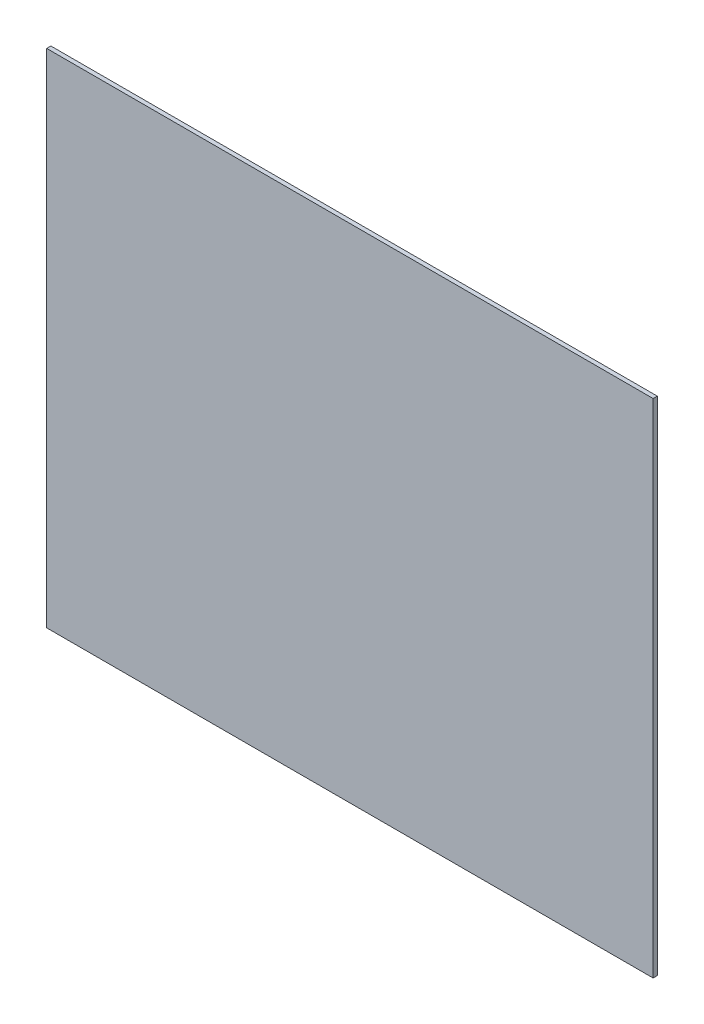
ISO-10303-21;
HEADER;
FILE_DESCRIPTION(('STEP AP214'),'2;1');
FILE_NAME('part.step','',(''),(''),'','','');
FILE_SCHEMA(('AUTOMOTIVE_DESIGN { 1 0 10303 214 1 1 1 1 }'));
ENDSEC;
DATA;
#1=APPLICATION_CONTEXT('core data for automotive mechanical design processes');
#2=APPLICATION_PROTOCOL_DEFINITION('international standard','automotive_design',2000,#1);
#3=PRODUCT_CONTEXT('',#1,'mechanical');
#4=PRODUCT('Part','Part','',(#3));
#5=PRODUCT_RELATED_PRODUCT_CATEGORY('part','',(#4));
#6=PRODUCT_DEFINITION_FORMATION('','',#4);
#7=PRODUCT_DEFINITION_CONTEXT('part definition',#1,'design');
#8=PRODUCT_DEFINITION('design','',#6,#7);
#9=PRODUCT_DEFINITION_SHAPE('','',#8);
#10=(LENGTH_UNIT() NAMED_UNIT(*) SI_UNIT(.MILLI.,.METRE.));
#11=(NAMED_UNIT(*) PLANE_ANGLE_UNIT() SI_UNIT($,.RADIAN.));
#12=(NAMED_UNIT(*) SI_UNIT($,.STERADIAN.) SOLID_ANGLE_UNIT());
#13=UNCERTAINTY_MEASURE_WITH_UNIT(LENGTH_MEASURE(1.E-05),#10,'distance_accuracy_value','');
#14=(GEOMETRIC_REPRESENTATION_CONTEXT(3) GLOBAL_UNCERTAINTY_ASSIGNED_CONTEXT((#13)) GLOBAL_UNIT_ASSIGNED_CONTEXT((#10,
#11,#12)) REPRESENTATION_CONTEXT('',''));
#15=CARTESIAN_POINT('',(0.,0.,0.));
#16=DIRECTION('',(0.,0.,1.));
#17=DIRECTION('',(1.,0.,0.));
#18=AXIS2_PLACEMENT_3D('',#15,#16,#17);
#19=CARTESIAN_POINT('',(-290.,0.,2.));
#20=DIRECTION('',(0.,1.,0.));
#21=DIRECTION('',(-1.,0.,0.));
#22=AXIS2_PLACEMENT_3D('',#19,#20,#21);
#23=PLANE('',#22);
#24=DIRECTION('',(1.,0.,0.));
#25=VECTOR('',#24,1.);
#26=CARTESIAN_POINT('',(-290.,0.,0.));
#27=LINE('',#26,#25);
#28=CARTESIAN_POINT('',(-290.,0.,0.));
#29=VERTEX_POINT('',#28);
#30=CARTESIAN_POINT('',(0.,0.,0.));
#31=VERTEX_POINT('',#30);
#32=EDGE_CURVE('E115',#29,#31,#27,.T.);
#33=ORIENTED_EDGE('',*,*,#32,.T.);
#34=DIRECTION('',(0.,0.,-1.));
#35=VECTOR('',#34,1.);
#36=CARTESIAN_POINT('',(0.,0.,2.));
#37=LINE('',#36,#35);
#38=CARTESIAN_POINT('',(0.,0.,2.));
#39=VERTEX_POINT('',#38);
#40=EDGE_CURVE('E11',#39,#31,#37,.T.);
#41=ORIENTED_EDGE('',*,*,#40,.F.);
#42=DIRECTION('',(1.,0.,0.));
#43=VECTOR('',#42,1.);
#44=CARTESIAN_POINT('',(-290.,0.,2.));
#45=LINE('',#44,#43);
#46=CARTESIAN_POINT('',(-290.,0.,2.));
#47=VERTEX_POINT('',#46);
#48=EDGE_CURVE('E98',#47,#39,#45,.T.);
#49=ORIENTED_EDGE('',*,*,#48,.F.);
#50=DIRECTION('',(0.,0.,-1.));
#51=VECTOR('',#50,1.);
#52=CARTESIAN_POINT('',(-290.,0.,2.));
#53=LINE('',#52,#51);
#54=EDGE_CURVE('E111',#47,#29,#53,.T.);
#55=ORIENTED_EDGE('',*,*,#54,.T.);
#56=EDGE_LOOP('',(#33,#41,#49,#55));
#57=FACE_BOUND('',#56,.T.);
#58=ADVANCED_FACE('F46',(#57),#23,.F.);
#59=CARTESIAN_POINT('',(0.,0.,2.));
#60=DIRECTION('',(-1.,0.,0.));
#61=DIRECTION('',(0.,-1.,0.));
#62=AXIS2_PLACEMENT_3D('',#59,#60,#61);
#63=PLANE('',#62);
#64=DIRECTION('',(0.,1.,0.));
#65=VECTOR('',#64,1.);
#66=CARTESIAN_POINT('',(0.,0.,0.));
#67=LINE('',#66,#65);
#68=CARTESIAN_POINT('',(0.,240.,0.));
#69=VERTEX_POINT('',#68);
#70=EDGE_CURVE('E103',#31,#69,#67,.T.);
#71=ORIENTED_EDGE('',*,*,#70,.T.);
#72=DIRECTION('',(0.,0.,-1.));
#73=VECTOR('',#72,1.);
#74=CARTESIAN_POINT('',(0.,240.,2.));
#75=LINE('',#74,#73);
#76=CARTESIAN_POINT('',(0.,240.,2.));
#77=VERTEX_POINT('',#76);
#78=EDGE_CURVE('E55',#77,#69,#75,.T.);
#79=ORIENTED_EDGE('',*,*,#78,.F.);
#80=DIRECTION('',(0.,1.,0.));
#81=VECTOR('',#80,1.);
#82=CARTESIAN_POINT('',(0.,0.,2.));
#83=LINE('',#82,#81);
#84=EDGE_CURVE('E93',#39,#77,#83,.T.);
#85=ORIENTED_EDGE('',*,*,#84,.F.);
#86=ORIENTED_EDGE('',*,*,#40,.T.);
#87=EDGE_LOOP('',(#71,#79,#85,#86));
#88=FACE_BOUND('',#87,.T.);
#89=ADVANCED_FACE('F102',(#88),#63,.F.);
#90=CARTESIAN_POINT('',(0.,240.,2.));
#91=DIRECTION('',(0.,-1.,0.));
#92=DIRECTION('',(0.,0.,-1.));
#93=AXIS2_PLACEMENT_3D('',#90,#91,#92);
#94=PLANE('',#93);
#95=DIRECTION('',(-1.,0.,0.));
#96=VECTOR('',#95,1.);
#97=CARTESIAN_POINT('',(0.,240.,0.));
#98=LINE('',#97,#96);
#99=CARTESIAN_POINT('',(-290.,240.,0.));
#100=VERTEX_POINT('',#99);
#101=EDGE_CURVE('E80',#69,#100,#98,.T.);
#102=ORIENTED_EDGE('',*,*,#101,.T.);
#103=DIRECTION('',(0.,0.,-1.));
#104=VECTOR('',#103,1.);
#105=CARTESIAN_POINT('',(-290.,240.,2.));
#106=LINE('',#105,#104);
#107=CARTESIAN_POINT('',(-290.,240.,2.));
#108=VERTEX_POINT('',#107);
#109=EDGE_CURVE('E105',#108,#100,#106,.T.);
#110=ORIENTED_EDGE('',*,*,#109,.F.);
#111=DIRECTION('',(-1.,0.,0.));
#112=VECTOR('',#111,1.);
#113=CARTESIAN_POINT('',(0.,240.,2.));
#114=LINE('',#113,#112);
#115=EDGE_CURVE('E96',#77,#108,#114,.T.);
#116=ORIENTED_EDGE('',*,*,#115,.F.);
#117=ORIENTED_EDGE('',*,*,#78,.T.);
#118=EDGE_LOOP('',(#102,#110,#116,#117));
#119=FACE_BOUND('',#118,.T.);
#120=ADVANCED_FACE('F106',(#119),#94,.F.);
#121=CARTESIAN_POINT('',(-290.,240.,2.));
#122=DIRECTION('',(1.,0.,0.));
#123=DIRECTION('',(0.,0.,-1.));
#124=AXIS2_PLACEMENT_3D('',#121,#122,#123);
#125=PLANE('',#124);
#126=DIRECTION('',(0.,-1.,0.));
#127=VECTOR('',#126,1.);
#128=CARTESIAN_POINT('',(-290.,240.,0.));
#129=LINE('',#128,#127);
#130=EDGE_CURVE('E86',#100,#29,#129,.T.);
#131=ORIENTED_EDGE('',*,*,#130,.T.);
#132=ORIENTED_EDGE('',*,*,#54,.F.);
#133=DIRECTION('',(0.,-1.,0.));
#134=VECTOR('',#133,1.);
#135=CARTESIAN_POINT('',(-290.,240.,2.));
#136=LINE('',#135,#134);
#137=EDGE_CURVE('E63',#108,#47,#136,.T.);
#138=ORIENTED_EDGE('',*,*,#137,.F.);
#139=ORIENTED_EDGE('',*,*,#109,.T.);
#140=EDGE_LOOP('',(#131,#132,#138,#139));
#141=FACE_BOUND('',#140,.T.);
#142=ADVANCED_FACE('F129',(#141),#125,.F.);
#143=CARTESIAN_POINT('',(0.,0.,2.));
#144=DIRECTION('',(0.,0.,1.));
#145=DIRECTION('',(1.,0.,0.));
#146=AXIS2_PLACEMENT_3D('',#143,#144,#145);
#147=PLANE('',#146);
#148=ORIENTED_EDGE('',*,*,#48,.T.);
#149=ORIENTED_EDGE('',*,*,#84,.T.);
#150=ORIENTED_EDGE('',*,*,#115,.T.);
#151=ORIENTED_EDGE('',*,*,#137,.T.);
#152=EDGE_LOOP('',(#148,#149,#150,#151));
#153=FACE_BOUND('',#152,.T.);
#154=ADVANCED_FACE('F94',(#153),#147,.T.);
#155=CARTESIAN_POINT('',(0.,0.,0.));
#156=DIRECTION('',(0.,0.,1.));
#157=DIRECTION('',(1.,0.,0.));
#158=AXIS2_PLACEMENT_3D('',#155,#156,#157);
#159=PLANE('',#158);
#160=ORIENTED_EDGE('',*,*,#32,.F.);
#161=ORIENTED_EDGE('',*,*,#130,.F.);
#162=ORIENTED_EDGE('',*,*,#101,.F.);
#163=ORIENTED_EDGE('',*,*,#70,.F.);
#164=EDGE_LOOP('',(#160,#161,#162,#163));
#165=FACE_BOUND('',#164,.T.);
#166=ADVANCED_FACE('F132',(#165),#159,.F.);
#167=CLOSED_SHELL('',(#58,#89,#120,#142,#154,#166));
#168=MANIFOLD_SOLID_BREP('B2',#167);
#169=ADVANCED_BREP_SHAPE_REPRESENTATION('',(#18,#168),#14);
#170=SHAPE_DEFINITION_REPRESENTATION(#9,#169);
ENDSEC;
END-ISO-10303-21;
